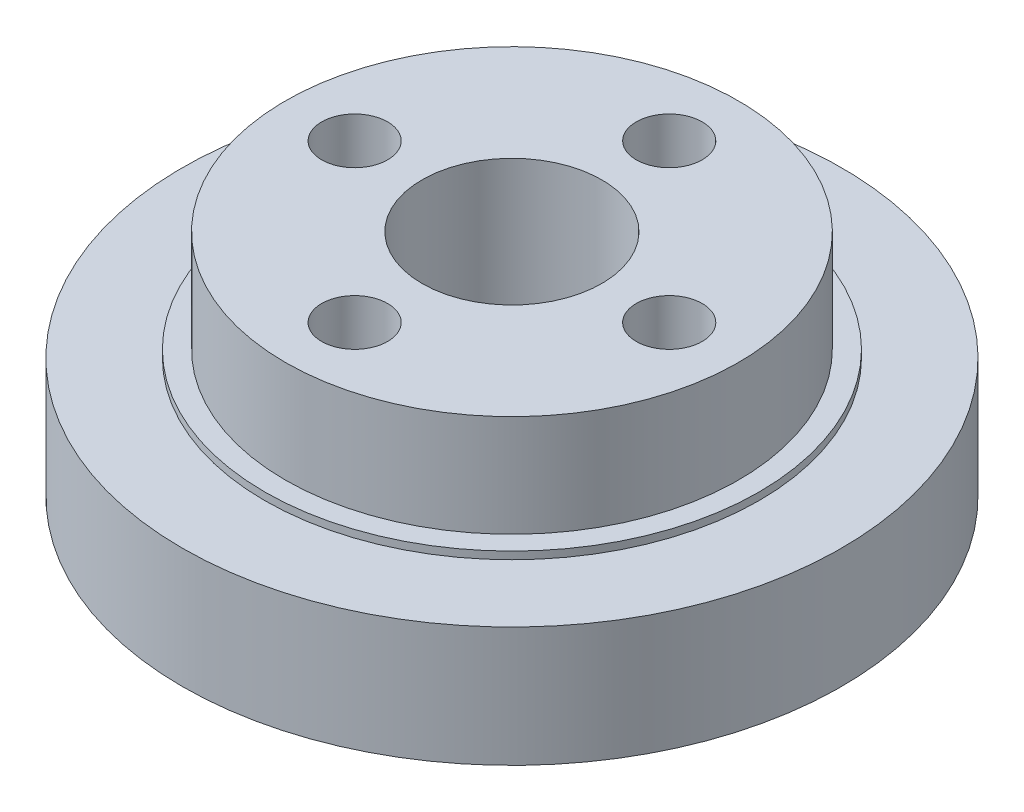
ISO-10303-21;
HEADER;
FILE_DESCRIPTION(('STEP AP214'),'2;1');
FILE_NAME('part.step','',(''),(''),'','','');
FILE_SCHEMA(('AUTOMOTIVE_DESIGN { 1 0 10303 214 1 1 1 1 }'));
ENDSEC;
DATA;
#1=APPLICATION_CONTEXT('core data for automotive mechanical design processes');
#2=APPLICATION_PROTOCOL_DEFINITION('international standard','automotive_design',2000,#1);
#3=PRODUCT_CONTEXT('',#1,'mechanical');
#4=PRODUCT('Part','Part','',(#3));
#5=PRODUCT_RELATED_PRODUCT_CATEGORY('part','',(#4));
#6=PRODUCT_DEFINITION_FORMATION('','',#4);
#7=PRODUCT_DEFINITION_CONTEXT('part definition',#1,'design');
#8=PRODUCT_DEFINITION('design','',#6,#7);
#9=PRODUCT_DEFINITION_SHAPE('','',#8);
#10=(LENGTH_UNIT() NAMED_UNIT(*) SI_UNIT(.MILLI.,.METRE.));
#11=(NAMED_UNIT(*) PLANE_ANGLE_UNIT() SI_UNIT($,.RADIAN.));
#12=(NAMED_UNIT(*) SI_UNIT($,.STERADIAN.) SOLID_ANGLE_UNIT());
#13=UNCERTAINTY_MEASURE_WITH_UNIT(LENGTH_MEASURE(1.E-05),#10,'distance_accuracy_value','');
#14=(GEOMETRIC_REPRESENTATION_CONTEXT(3) GLOBAL_UNCERTAINTY_ASSIGNED_CONTEXT((#13)) GLOBAL_UNIT_ASSIGNED_CONTEXT((#10,
#11,#12)) REPRESENTATION_CONTEXT('',''));
#15=CARTESIAN_POINT('',(0.,0.,0.));
#16=DIRECTION('',(0.,0.,1.));
#17=DIRECTION('',(1.,0.,0.));
#18=AXIS2_PLACEMENT_3D('',#15,#16,#17);
#19=CARTESIAN_POINT('',(0.,8.,0.));
#20=DIRECTION('',(0.,-1.,0.));
#21=DIRECTION('',(0.,0.,-1.));
#22=AXIS2_PLACEMENT_3D('',#19,#20,#21);
#23=CYLINDRICAL_SURFACE('',#22,22.);
#24=CARTESIAN_POINT('',(0.,8.,0.));
#25=DIRECTION('',(0.,1.,0.));
#26=DIRECTION('',(0.,0.,1.));
#27=AXIS2_PLACEMENT_3D('',#24,#25,#26);
#28=CIRCLE('',#27,22.);
#29=CARTESIAN_POINT('',(0.,8.,22.));
#30=VERTEX_POINT('',#29);
#31=EDGE_CURVE('E47',#30,#30,#28,.T.);
#32=ORIENTED_EDGE('',*,*,#31,.F.);
#33=EDGE_LOOP('',(#32));
#34=FACE_BOUND('',#33,.T.);
#35=CARTESIAN_POINT('',(0.,0.,0.));
#36=DIRECTION('',(0.,1.,0.));
#37=DIRECTION('',(0.,0.,1.));
#38=AXIS2_PLACEMENT_3D('',#35,#36,#37);
#39=CIRCLE('',#38,22.);
#40=CARTESIAN_POINT('',(0.,0.,22.));
#41=VERTEX_POINT('',#40);
#42=EDGE_CURVE('E37',#41,#41,#39,.T.);
#43=ORIENTED_EDGE('',*,*,#42,.T.);
#44=EDGE_LOOP('',(#43));
#45=FACE_BOUND('',#44,.T.);
#46=ADVANCED_FACE('F40',(#34,#45),#23,.T.);
#47=CARTESIAN_POINT('',(0.,8.,0.));
#48=DIRECTION('',(0.,1.,0.));
#49=DIRECTION('',(0.,0.,1.));
#50=AXIS2_PLACEMENT_3D('',#47,#48,#49);
#51=PLANE('',#50);
#52=CARTESIAN_POINT('',(0.,8.,0.));
#53=DIRECTION('',(0.,1.,0.));
#54=DIRECTION('',(0.,0.,1.));
#55=AXIS2_PLACEMENT_3D('',#52,#53,#54);
#56=CIRCLE('',#55,16.5);
#57=CARTESIAN_POINT('',(0.,8.,16.5));
#58=VERTEX_POINT('',#57);
#59=EDGE_CURVE('E42',#58,#58,#56,.T.);
#60=ORIENTED_EDGE('',*,*,#59,.F.);
#61=EDGE_LOOP('',(#60));
#62=FACE_BOUND('',#61,.T.);
#63=ORIENTED_EDGE('',*,*,#31,.T.);
#64=EDGE_LOOP('',(#63));
#65=FACE_BOUND('',#64,.T.);
#66=ADVANCED_FACE('F70',(#62,#65),#51,.T.);
#67=CARTESIAN_POINT('',(0.,0.,0.));
#68=DIRECTION('',(0.,1.,0.));
#69=DIRECTION('',(0.,0.,1.));
#70=AXIS2_PLACEMENT_3D('',#67,#68,#69);
#71=PLANE('',#70);
#72=CARTESIAN_POINT('',(11.6424272344222,0.,14.3772002869538));
#73=DIRECTION('',(0.,1.,0.));
#74=DIRECTION('',(-0.866025403784433,0.,0.50000000000001));
#75=AXIS2_PLACEMENT_3D('',#72,#73,#74);
#76=CIRCLE('',#75,1.6);
#77=CARTESIAN_POINT('',(10.2567865883671,0.,15.1772002869538));
#78=VERTEX_POINT('',#77);
#79=EDGE_CURVE('E367',#78,#78,#76,.T.);
#80=ORIENTED_EDGE('',*,*,#79,.T.);
#81=EDGE_LOOP('',(#80));
#82=FACE_BOUND('',#81,.T.);
#83=CARTESIAN_POINT('',(-6.62980706658789,0.,17.2712378901983));
#84=DIRECTION('',(0.,1.,0.));
#85=DIRECTION('',(-0.866025403784443,0.,-0.499999999999992));
#86=AXIS2_PLACEMENT_3D('',#83,#84,#85);
#87=CIRCLE('',#86,1.6);
#88=CARTESIAN_POINT('',(-8.015447712643,0.,16.4712378901983));
#89=VERTEX_POINT('',#88);
#90=EDGE_CURVE('E376',#89,#89,#87,.T.);
#91=ORIENTED_EDGE('',*,*,#90,.T.);
#92=EDGE_LOOP('',(#91));
#93=FACE_BOUND('',#92,.T.);
#94=CARTESIAN_POINT('',(-18.27223430101,0.,2.89403760324427));
#95=DIRECTION('',(0.,1.,0.));
#96=DIRECTION('',(0.,0.,-1.));
#97=AXIS2_PLACEMENT_3D('',#94,#95,#96);
#98=CIRCLE('',#97,1.6);
#99=CARTESIAN_POINT('',(-18.27223430101,0.,1.29403760324427));
#100=VERTEX_POINT('',#99);
#101=EDGE_CURVE('E385',#100,#100,#98,.T.);
#102=ORIENTED_EDGE('',*,*,#101,.T.);
#103=EDGE_LOOP('',(#102));
#104=FACE_BOUND('',#103,.T.);
#105=CARTESIAN_POINT('',(-11.6424272344221,0.,-14.3772002869539));
#106=DIRECTION('',(0.,1.,0.));
#107=DIRECTION('',(0.866025403784436,0.,-0.500000000000004));
#108=AXIS2_PLACEMENT_3D('',#105,#106,#107);
#109=CIRCLE('',#108,1.6);
#110=CARTESIAN_POINT('',(-10.256786588367,0.,-15.1772002869539));
#111=VERTEX_POINT('',#110);
#112=EDGE_CURVE('E389',#111,#111,#109,.T.);
#113=ORIENTED_EDGE('',*,*,#112,.T.);
#114=EDGE_LOOP('',(#113));
#115=FACE_BOUND('',#114,.T.);
#116=CARTESIAN_POINT('',(6.62980706658801,0.,-17.2712378901982));
#117=DIRECTION('',(0.,1.,0.));
#118=DIRECTION('',(0.86602540378444,0.,0.499999999999998));
#119=AXIS2_PLACEMENT_3D('',#116,#117,#118);
#120=CIRCLE('',#119,1.6);
#121=CARTESIAN_POINT('',(8.01544771264312,0.,-16.4712378901982));
#122=VERTEX_POINT('',#121);
#123=EDGE_CURVE('E365',#122,#122,#120,.T.);
#124=ORIENTED_EDGE('',*,*,#123,.T.);
#125=EDGE_LOOP('',(#124));
#126=FACE_BOUND('',#125,.T.);
#127=CARTESIAN_POINT('',(18.27223430101,0.,-2.89403760324427));
#128=DIRECTION('',(0.,1.,0.));
#129=DIRECTION('',(0.,0.,1.));
#130=AXIS2_PLACEMENT_3D('',#127,#128,#129);
#131=CIRCLE('',#130,1.6);
#132=CARTESIAN_POINT('',(18.27223430101,0.,-1.29403760324427));
#133=VERTEX_POINT('',#132);
#134=EDGE_CURVE('E356',#133,#133,#131,.T.);
#135=ORIENTED_EDGE('',*,*,#134,.T.);
#136=EDGE_LOOP('',(#135));
#137=FACE_BOUND('',#136,.T.);
#138=CARTESIAN_POINT('',(0.,0.,0.));
#139=DIRECTION('',(0.,1.,0.));
#140=DIRECTION('',(0.,0.,1.));
#141=AXIS2_PLACEMENT_3D('',#138,#139,#140);
#142=CIRCLE('',#141,6.);
#143=CARTESIAN_POINT('',(0.,0.,6.));
#144=VERTEX_POINT('',#143);
#145=EDGE_CURVE('E351',#144,#144,#142,.T.);
#146=ORIENTED_EDGE('',*,*,#145,.T.);
#147=EDGE_LOOP('',(#146));
#148=FACE_BOUND('',#147,.T.);
#149=ORIENTED_EDGE('',*,*,#42,.F.);
#150=EDGE_LOOP('',(#149));
#151=FACE_BOUND('',#150,.T.);
#152=ADVANCED_FACE('F63',(#82,#93,#104,#115,#126,#137,#148,#151),#71,.F.);
#153=CARTESIAN_POINT('',(0.,8.5,0.));
#154=DIRECTION('',(0.,-1.,0.));
#155=DIRECTION('',(0.,0.,-1.));
#156=AXIS2_PLACEMENT_3D('',#153,#154,#155);
#157=CYLINDRICAL_SURFACE('',#156,16.5);
#158=CARTESIAN_POINT('',(0.,8.5,0.));
#159=DIRECTION('',(0.,1.,0.));
#160=DIRECTION('',(0.,0.,1.));
#161=AXIS2_PLACEMENT_3D('',#158,#159,#160);
#162=CIRCLE('',#161,16.5);
#163=CARTESIAN_POINT('',(0.,8.5,16.5));
#164=VERTEX_POINT('',#163);
#165=EDGE_CURVE('E54',#164,#164,#162,.T.);
#166=ORIENTED_EDGE('',*,*,#165,.F.);
#167=EDGE_LOOP('',(#166));
#168=FACE_BOUND('',#167,.T.);
#169=ORIENTED_EDGE('',*,*,#59,.T.);
#170=EDGE_LOOP('',(#169));
#171=FACE_BOUND('',#170,.T.);
#172=ADVANCED_FACE('F68',(#168,#171),#157,.T.);
#173=CARTESIAN_POINT('',(0.,8.5,0.));
#174=DIRECTION('',(0.,1.,0.));
#175=DIRECTION('',(0.,0.,1.));
#176=AXIS2_PLACEMENT_3D('',#173,#174,#175);
#177=PLANE('',#176);
#178=CARTESIAN_POINT('',(0.,8.5,0.));
#179=DIRECTION('',(0.,1.,0.));
#180=DIRECTION('',(0.,0.,1.));
#181=AXIS2_PLACEMENT_3D('',#178,#179,#180);
#182=CIRCLE('',#181,15.125);
#183=CARTESIAN_POINT('',(0.,8.5,15.125));
#184=VERTEX_POINT('',#183);
#185=EDGE_CURVE('E10',#184,#184,#182,.T.);
#186=ORIENTED_EDGE('',*,*,#185,.F.);
#187=EDGE_LOOP('',(#186));
#188=FACE_BOUND('',#187,.T.);
#189=ORIENTED_EDGE('',*,*,#165,.T.);
#190=EDGE_LOOP('',(#189));
#191=FACE_BOUND('',#190,.T.);
#192=ADVANCED_FACE('F74',(#188,#191),#177,.T.);
#193=CARTESIAN_POINT('',(0.,15.3,0.));
#194=DIRECTION('',(0.,-1.,0.));
#195=DIRECTION('',(0.,0.,-1.));
#196=AXIS2_PLACEMENT_3D('',#193,#194,#195);
#197=CYLINDRICAL_SURFACE('',#196,15.125);
#198=CARTESIAN_POINT('',(0.,15.3,0.));
#199=DIRECTION('',(0.,1.,0.));
#200=DIRECTION('',(0.,0.,1.));
#201=AXIS2_PLACEMENT_3D('',#198,#199,#200);
#202=CIRCLE('',#201,15.125);
#203=CARTESIAN_POINT('',(0.,15.3,15.125));
#204=VERTEX_POINT('',#203);
#205=EDGE_CURVE('E52',#204,#204,#202,.T.);
#206=ORIENTED_EDGE('',*,*,#205,.F.);
#207=EDGE_LOOP('',(#206));
#208=FACE_BOUND('',#207,.T.);
#209=ORIENTED_EDGE('',*,*,#185,.T.);
#210=EDGE_LOOP('',(#209));
#211=FACE_BOUND('',#210,.T.);
#212=ADVANCED_FACE('F103',(#208,#211),#197,.T.);
#213=CARTESIAN_POINT('',(0.,15.3,0.));
#214=DIRECTION('',(0.,1.,0.));
#215=DIRECTION('',(0.,0.,1.));
#216=AXIS2_PLACEMENT_3D('',#213,#214,#215);
#217=PLANE('',#216);
#218=CARTESIAN_POINT('',(0.,15.3,10.5));
#219=DIRECTION('',(0.,1.,0.));
#220=DIRECTION('',(-1.,0.,0.));
#221=AXIS2_PLACEMENT_3D('',#218,#219,#220);
#222=CIRCLE('',#221,2.2);
#223=CARTESIAN_POINT('',(-2.20000000000004,15.3,10.5));
#224=VERTEX_POINT('',#223);
#225=EDGE_CURVE('E335',#224,#224,#222,.T.);
#226=ORIENTED_EDGE('',*,*,#225,.F.);
#227=EDGE_LOOP('',(#226));
#228=FACE_BOUND('',#227,.T.);
#229=CARTESIAN_POINT('',(-10.5,15.3,0.));
#230=DIRECTION('',(0.,1.,0.));
#231=DIRECTION('',(0.,0.,-1.));
#232=AXIS2_PLACEMENT_3D('',#229,#230,#231);
#233=CIRCLE('',#232,2.2);
#234=CARTESIAN_POINT('',(-10.5,15.3,-2.2));
#235=VERTEX_POINT('',#234);
#236=EDGE_CURVE('E336',#235,#235,#233,.T.);
#237=ORIENTED_EDGE('',*,*,#236,.F.);
#238=EDGE_LOOP('',(#237));
#239=FACE_BOUND('',#238,.T.);
#240=CARTESIAN_POINT('',(1.09981662173559E-13,15.3,-10.5));
#241=DIRECTION('',(0.,1.,0.));
#242=DIRECTION('',(1.,0.,0.));
#243=AXIS2_PLACEMENT_3D('',#240,#241,#242);
#244=CIRCLE('',#243,2.2);
#245=CARTESIAN_POINT('',(2.20000000000011,15.3,-10.5));
#246=VERTEX_POINT('',#245);
#247=EDGE_CURVE('E340',#246,#246,#244,.T.);
#248=ORIENTED_EDGE('',*,*,#247,.F.);
#249=EDGE_LOOP('',(#248));
#250=FACE_BOUND('',#249,.T.);
#251=CARTESIAN_POINT('',(10.5,15.3,0.));
#252=DIRECTION('',(0.,1.,0.));
#253=DIRECTION('',(0.,0.,1.));
#254=AXIS2_PLACEMENT_3D('',#251,#252,#253);
#255=CIRCLE('',#254,2.2);
#256=CARTESIAN_POINT('',(10.5,15.3,2.2));
#257=VERTEX_POINT('',#256);
#258=EDGE_CURVE('E344',#257,#257,#255,.T.);
#259=ORIENTED_EDGE('',*,*,#258,.F.);
#260=EDGE_LOOP('',(#259));
#261=FACE_BOUND('',#260,.T.);
#262=CARTESIAN_POINT('',(0.,15.3,0.));
#263=DIRECTION('',(0.,1.,0.));
#264=DIRECTION('',(0.,0.,1.));
#265=AXIS2_PLACEMENT_3D('',#262,#263,#264);
#266=CIRCLE('',#265,6.);
#267=CARTESIAN_POINT('',(0.,15.3,6.));
#268=VERTEX_POINT('',#267);
#269=EDGE_CURVE('E346',#268,#268,#266,.T.);
#270=ORIENTED_EDGE('',*,*,#269,.F.);
#271=EDGE_LOOP('',(#270));
#272=FACE_BOUND('',#271,.T.);
#273=ORIENTED_EDGE('',*,*,#205,.T.);
#274=EDGE_LOOP('',(#273));
#275=FACE_BOUND('',#274,.T.);
#276=ADVANCED_FACE('F115',(#228,#239,#250,#261,#272,#275),#217,.T.);
#277=CARTESIAN_POINT('',(0.,0.,0.));
#278=DIRECTION('',(0.,1.,0.));
#279=DIRECTION('',(0.,0.,1.));
#280=AXIS2_PLACEMENT_3D('',#277,#278,#279);
#281=CYLINDRICAL_SURFACE('',#280,6.);
#282=ORIENTED_EDGE('',*,*,#145,.F.);
#283=EDGE_LOOP('',(#282));
#284=FACE_BOUND('',#283,.T.);
#285=ORIENTED_EDGE('',*,*,#269,.T.);
#286=EDGE_LOOP('',(#285));
#287=FACE_BOUND('',#286,.T.);
#288=ADVANCED_FACE('F118',(#284,#287),#281,.F.);
#289=CARTESIAN_POINT('',(18.27223430101,7.,-2.89403760324427));
#290=DIRECTION('',(0.,-1.,0.));
#291=DIRECTION('',(0.,0.,-1.));
#292=AXIS2_PLACEMENT_3D('',#289,#290,#291);
#293=CYLINDRICAL_SURFACE('',#292,1.6);
#294=CARTESIAN_POINT('',(18.27223430101,7.,-2.89403760324427));
#295=DIRECTION('',(0.,1.,0.));
#296=DIRECTION('',(0.,0.,1.));
#297=AXIS2_PLACEMENT_3D('',#294,#295,#296);
#298=CIRCLE('',#297,1.6);
#299=CARTESIAN_POINT('',(18.27223430101,7.,-1.29403760324427));
#300=VERTEX_POINT('',#299);
#301=EDGE_CURVE('E358',#300,#300,#298,.T.);
#302=ORIENTED_EDGE('',*,*,#301,.T.);
#303=EDGE_LOOP('',(#302));
#304=FACE_BOUND('',#303,.T.);
#305=ORIENTED_EDGE('',*,*,#134,.F.);
#306=EDGE_LOOP('',(#305));
#307=FACE_BOUND('',#306,.T.);
#308=ADVANCED_FACE('F121',(#304,#307),#293,.F.);
#309=CARTESIAN_POINT('',(18.27223430101,7.,-2.89403760324427));
#310=DIRECTION('',(0.,1.,0.));
#311=DIRECTION('',(0.,0.,1.));
#312=AXIS2_PLACEMENT_3D('',#309,#310,#311);
#313=PLANE('',#312);
#314=ORIENTED_EDGE('',*,*,#301,.F.);
#315=EDGE_LOOP('',(#314));
#316=FACE_BOUND('',#315,.T.);
#317=ADVANCED_FACE('F131',(#316),#313,.F.);
#318=CARTESIAN_POINT('',(6.62980706658801,7.,-17.2712378901982));
#319=DIRECTION('',(0.,-1.,0.));
#320=DIRECTION('',(0.,0.,-1.));
#321=AXIS2_PLACEMENT_3D('',#318,#319,#320);
#322=CYLINDRICAL_SURFACE('',#321,1.6);
#323=CARTESIAN_POINT('',(6.62980706658801,7.,-17.2712378901982));
#324=DIRECTION('',(0.,1.,0.));
#325=DIRECTION('',(0.86602540378444,0.,0.499999999999998));
#326=AXIS2_PLACEMENT_3D('',#323,#324,#325);
#327=CIRCLE('',#326,1.6);
#328=CARTESIAN_POINT('',(8.01544771264312,7.,-16.4712378901982));
#329=VERTEX_POINT('',#328);
#330=EDGE_CURVE('E363',#329,#329,#327,.T.);
#331=ORIENTED_EDGE('',*,*,#330,.T.);
#332=EDGE_LOOP('',(#331));
#333=FACE_BOUND('',#332,.T.);
#334=ORIENTED_EDGE('',*,*,#123,.F.);
#335=EDGE_LOOP('',(#334));
#336=FACE_BOUND('',#335,.T.);
#337=ADVANCED_FACE('F139',(#333,#336),#322,.F.);
#338=CARTESIAN_POINT('',(6.62980706658801,7.,-17.2712378901982));
#339=DIRECTION('',(0.,1.,0.));
#340=DIRECTION('',(0.86602540378444,0.,0.499999999999998));
#341=AXIS2_PLACEMENT_3D('',#338,#339,#340);
#342=PLANE('',#341);
#343=ORIENTED_EDGE('',*,*,#330,.F.);
#344=EDGE_LOOP('',(#343));
#345=FACE_BOUND('',#344,.T.);
#346=ADVANCED_FACE('F151',(#345),#342,.F.);
#347=CARTESIAN_POINT('',(-11.6424272344221,7.,-14.3772002869539));
#348=DIRECTION('',(0.,-1.,0.));
#349=DIRECTION('',(0.,0.,-1.));
#350=AXIS2_PLACEMENT_3D('',#347,#348,#349);
#351=CYLINDRICAL_SURFACE('',#350,1.6);
#352=CARTESIAN_POINT('',(-11.6424272344221,7.,-14.3772002869539));
#353=DIRECTION('',(0.,1.,0.));
#354=DIRECTION('',(0.866025403784436,0.,-0.500000000000004));
#355=AXIS2_PLACEMENT_3D('',#352,#353,#354);
#356=CIRCLE('',#355,1.6);
#357=CARTESIAN_POINT('',(-10.256786588367,7.,-15.1772002869539));
#358=VERTEX_POINT('',#357);
#359=EDGE_CURVE('E370',#358,#358,#356,.T.);
#360=ORIENTED_EDGE('',*,*,#359,.T.);
#361=EDGE_LOOP('',(#360));
#362=FACE_BOUND('',#361,.T.);
#363=ORIENTED_EDGE('',*,*,#112,.F.);
#364=EDGE_LOOP('',(#363));
#365=FACE_BOUND('',#364,.T.);
#366=ADVANCED_FACE('F161',(#362,#365),#351,.F.);
#367=CARTESIAN_POINT('',(-11.6424272344221,7.,-14.3772002869539));
#368=DIRECTION('',(0.,1.,0.));
#369=DIRECTION('',(0.866025403784436,0.,-0.500000000000004));
#370=AXIS2_PLACEMENT_3D('',#367,#368,#369);
#371=PLANE('',#370);
#372=ORIENTED_EDGE('',*,*,#359,.F.);
#373=EDGE_LOOP('',(#372));
#374=FACE_BOUND('',#373,.T.);
#375=ADVANCED_FACE('F171',(#374),#371,.F.);
#376=CARTESIAN_POINT('',(-18.27223430101,7.,2.89403760324427));
#377=DIRECTION('',(0.,-1.,0.));
#378=DIRECTION('',(0.,0.,-1.));
#379=AXIS2_PLACEMENT_3D('',#376,#377,#378);
#380=CYLINDRICAL_SURFACE('',#379,1.6);
#381=CARTESIAN_POINT('',(-18.27223430101,7.,2.89403760324427));
#382=DIRECTION('',(0.,1.,0.));
#383=DIRECTION('',(0.,0.,-1.));
#384=AXIS2_PLACEMENT_3D('',#381,#382,#383);
#385=CIRCLE('',#384,1.6);
#386=CARTESIAN_POINT('',(-18.27223430101,7.,1.29403760324427));
#387=VERTEX_POINT('',#386);
#388=EDGE_CURVE('E384',#387,#387,#385,.T.);
#389=ORIENTED_EDGE('',*,*,#388,.T.);
#390=EDGE_LOOP('',(#389));
#391=FACE_BOUND('',#390,.T.);
#392=ORIENTED_EDGE('',*,*,#101,.F.);
#393=EDGE_LOOP('',(#392));
#394=FACE_BOUND('',#393,.T.);
#395=ADVANCED_FACE('F182',(#391,#394),#380,.F.);
#396=CARTESIAN_POINT('',(-18.27223430101,7.,2.89403760324427));
#397=DIRECTION('',(0.,1.,0.));
#398=DIRECTION('',(0.,0.,-1.));
#399=AXIS2_PLACEMENT_3D('',#396,#397,#398);
#400=PLANE('',#399);
#401=ORIENTED_EDGE('',*,*,#388,.F.);
#402=EDGE_LOOP('',(#401));
#403=FACE_BOUND('',#402,.T.);
#404=ADVANCED_FACE('F193',(#403),#400,.F.);
#405=CARTESIAN_POINT('',(-6.62980706658789,7.,17.2712378901983));
#406=DIRECTION('',(0.,-1.,0.));
#407=DIRECTION('',(0.,0.,-1.));
#408=AXIS2_PLACEMENT_3D('',#405,#406,#407);
#409=CYLINDRICAL_SURFACE('',#408,1.6);
#410=CARTESIAN_POINT('',(-6.62980706658789,7.,17.2712378901983));
#411=DIRECTION('',(0.,1.,0.));
#412=DIRECTION('',(-0.866025403784443,0.,-0.499999999999992));
#413=AXIS2_PLACEMENT_3D('',#410,#411,#412);
#414=CIRCLE('',#413,1.6);
#415=CARTESIAN_POINT('',(-8.015447712643,7.,16.4712378901983));
#416=VERTEX_POINT('',#415);
#417=EDGE_CURVE('E377',#416,#416,#414,.T.);
#418=ORIENTED_EDGE('',*,*,#417,.T.);
#419=EDGE_LOOP('',(#418));
#420=FACE_BOUND('',#419,.T.);
#421=ORIENTED_EDGE('',*,*,#90,.F.);
#422=EDGE_LOOP('',(#421));
#423=FACE_BOUND('',#422,.T.);
#424=ADVANCED_FACE('F203',(#420,#423),#409,.F.);
#425=CARTESIAN_POINT('',(-6.62980706658789,7.,17.2712378901983));
#426=DIRECTION('',(0.,1.,0.));
#427=DIRECTION('',(-0.866025403784443,0.,-0.499999999999992));
#428=AXIS2_PLACEMENT_3D('',#425,#426,#427);
#429=PLANE('',#428);
#430=ORIENTED_EDGE('',*,*,#417,.F.);
#431=EDGE_LOOP('',(#430));
#432=FACE_BOUND('',#431,.T.);
#433=ADVANCED_FACE('F211',(#432),#429,.F.);
#434=CARTESIAN_POINT('',(11.6424272344222,7.,14.3772002869538));
#435=DIRECTION('',(0.,-1.,0.));
#436=DIRECTION('',(0.,0.,-1.));
#437=AXIS2_PLACEMENT_3D('',#434,#435,#436);
#438=CYLINDRICAL_SURFACE('',#437,1.6);
#439=CARTESIAN_POINT('',(11.6424272344222,7.,14.3772002869538));
#440=DIRECTION('',(0.,1.,0.));
#441=DIRECTION('',(-0.866025403784433,0.,0.50000000000001));
#442=AXIS2_PLACEMENT_3D('',#439,#440,#441);
#443=CIRCLE('',#442,1.6);
#444=CARTESIAN_POINT('',(10.2567865883671,7.,15.1772002869538));
#445=VERTEX_POINT('',#444);
#446=EDGE_CURVE('E375',#445,#445,#443,.T.);
#447=ORIENTED_EDGE('',*,*,#446,.T.);
#448=EDGE_LOOP('',(#447));
#449=FACE_BOUND('',#448,.T.);
#450=ORIENTED_EDGE('',*,*,#79,.F.);
#451=EDGE_LOOP('',(#450));
#452=FACE_BOUND('',#451,.T.);
#453=ADVANCED_FACE('F222',(#449,#452),#438,.F.);
#454=CARTESIAN_POINT('',(11.6424272344222,7.,14.3772002869538));
#455=DIRECTION('',(0.,1.,0.));
#456=DIRECTION('',(-0.866025403784433,0.,0.50000000000001));
#457=AXIS2_PLACEMENT_3D('',#454,#455,#456);
#458=PLANE('',#457);
#459=ORIENTED_EDGE('',*,*,#446,.F.);
#460=EDGE_LOOP('',(#459));
#461=FACE_BOUND('',#460,.T.);
#462=ADVANCED_FACE('F233',(#461),#458,.F.);
#463=CARTESIAN_POINT('',(10.5,9.8,0.));
#464=DIRECTION('',(0.,1.,0.));
#465=DIRECTION('',(0.,0.,1.));
#466=AXIS2_PLACEMENT_3D('',#463,#464,#465);
#467=CYLINDRICAL_SURFACE('',#466,2.2);
#468=CARTESIAN_POINT('',(10.5,9.8,0.));
#469=DIRECTION('',(0.,1.,0.));
#470=DIRECTION('',(0.,0.,1.));
#471=AXIS2_PLACEMENT_3D('',#468,#469,#470);
#472=CIRCLE('',#471,2.2);
#473=CARTESIAN_POINT('',(10.5,9.8,2.2));
#474=VERTEX_POINT('',#473);
#475=EDGE_CURVE('E373',#474,#474,#472,.T.);
#476=ORIENTED_EDGE('',*,*,#475,.F.);
#477=EDGE_LOOP('',(#476));
#478=FACE_BOUND('',#477,.T.);
#479=ORIENTED_EDGE('',*,*,#258,.T.);
#480=EDGE_LOOP('',(#479));
#481=FACE_BOUND('',#480,.T.);
#482=ADVANCED_FACE('F241',(#478,#481),#467,.F.);
#483=CARTESIAN_POINT('',(10.5,9.8,0.));
#484=DIRECTION('',(0.,1.,0.));
#485=DIRECTION('',(0.,0.,1.));
#486=AXIS2_PLACEMENT_3D('',#483,#484,#485);
#487=PLANE('',#486);
#488=ORIENTED_EDGE('',*,*,#475,.T.);
#489=EDGE_LOOP('',(#488));
#490=FACE_BOUND('',#489,.T.);
#491=ADVANCED_FACE('F253',(#490),#487,.T.);
#492=CARTESIAN_POINT('',(1.09981662173559E-13,9.8,-10.5));
#493=DIRECTION('',(0.,1.,0.));
#494=DIRECTION('',(0.,0.,1.));
#495=AXIS2_PLACEMENT_3D('',#492,#493,#494);
#496=CYLINDRICAL_SURFACE('',#495,2.2);
#497=CARTESIAN_POINT('',(1.09981662173559E-13,9.8,-10.5));
#498=DIRECTION('',(0.,1.,0.));
#499=DIRECTION('',(1.,0.,0.));
#500=AXIS2_PLACEMENT_3D('',#497,#498,#499);
#501=CIRCLE('',#500,2.2);
#502=CARTESIAN_POINT('',(2.20000000000011,9.8,-10.5));
#503=VERTEX_POINT('',#502);
#504=EDGE_CURVE('E396',#503,#503,#501,.T.);
#505=ORIENTED_EDGE('',*,*,#504,.F.);
#506=EDGE_LOOP('',(#505));
#507=FACE_BOUND('',#506,.T.);
#508=ORIENTED_EDGE('',*,*,#247,.T.);
#509=EDGE_LOOP('',(#508));
#510=FACE_BOUND('',#509,.T.);
#511=ADVANCED_FACE('F261',(#507,#510),#496,.F.);
#512=CARTESIAN_POINT('',(1.09981662173559E-13,9.8,-10.5));
#513=DIRECTION('',(0.,1.,0.));
#514=DIRECTION('',(1.,0.,0.));
#515=AXIS2_PLACEMENT_3D('',#512,#513,#514);
#516=PLANE('',#515);
#517=ORIENTED_EDGE('',*,*,#504,.T.);
#518=EDGE_LOOP('',(#517));
#519=FACE_BOUND('',#518,.T.);
#520=ADVANCED_FACE('F275',(#519),#516,.T.);
#521=CARTESIAN_POINT('',(-10.5,9.8,0.));
#522=DIRECTION('',(0.,1.,0.));
#523=DIRECTION('',(0.,0.,1.));
#524=AXIS2_PLACEMENT_3D('',#521,#522,#523);
#525=CYLINDRICAL_SURFACE('',#524,2.2);
#526=CARTESIAN_POINT('',(-10.5,9.8,0.));
#527=DIRECTION('',(0.,1.,0.));
#528=DIRECTION('',(0.,0.,-1.));
#529=AXIS2_PLACEMENT_3D('',#526,#527,#528);
#530=CIRCLE('',#529,2.2);
#531=CARTESIAN_POINT('',(-10.5,9.8,-2.2));
#532=VERTEX_POINT('',#531);
#533=EDGE_CURVE('E405',#532,#532,#530,.T.);
#534=ORIENTED_EDGE('',*,*,#533,.F.);
#535=EDGE_LOOP('',(#534));
#536=FACE_BOUND('',#535,.T.);
#537=ORIENTED_EDGE('',*,*,#236,.T.);
#538=EDGE_LOOP('',(#537));
#539=FACE_BOUND('',#538,.T.);
#540=ADVANCED_FACE('F282',(#536,#539),#525,.F.);
#541=CARTESIAN_POINT('',(-10.5,9.8,0.));
#542=DIRECTION('',(0.,1.,0.));
#543=DIRECTION('',(0.,0.,-1.));
#544=AXIS2_PLACEMENT_3D('',#541,#542,#543);
#545=PLANE('',#544);
#546=ORIENTED_EDGE('',*,*,#533,.T.);
#547=EDGE_LOOP('',(#546));
#548=FACE_BOUND('',#547,.T.);
#549=ADVANCED_FACE('F295',(#548),#545,.T.);
#550=CARTESIAN_POINT('',(0.,9.8,10.5));
#551=DIRECTION('',(0.,1.,0.));
#552=DIRECTION('',(0.,0.,1.));
#553=AXIS2_PLACEMENT_3D('',#550,#551,#552);
#554=CYLINDRICAL_SURFACE('',#553,2.2);
#555=CARTESIAN_POINT('',(0.,9.8,10.5));
#556=DIRECTION('',(0.,1.,0.));
#557=DIRECTION('',(-1.,0.,0.));
#558=AXIS2_PLACEMENT_3D('',#555,#556,#557);
#559=CIRCLE('',#558,2.2);
#560=CARTESIAN_POINT('',(-2.20000000000004,9.8,10.5));
#561=VERTEX_POINT('',#560);
#562=EDGE_CURVE('E393',#561,#561,#559,.T.);
#563=ORIENTED_EDGE('',*,*,#562,.F.);
#564=EDGE_LOOP('',(#563));
#565=FACE_BOUND('',#564,.T.);
#566=ORIENTED_EDGE('',*,*,#225,.T.);
#567=EDGE_LOOP('',(#566));
#568=FACE_BOUND('',#567,.T.);
#569=ADVANCED_FACE('F305',(#565,#568),#554,.F.);
#570=CARTESIAN_POINT('',(0.,9.8,10.5));
#571=DIRECTION('',(0.,1.,0.));
#572=DIRECTION('',(-1.,0.,0.));
#573=AXIS2_PLACEMENT_3D('',#570,#571,#572);
#574=PLANE('',#573);
#575=ORIENTED_EDGE('',*,*,#562,.T.);
#576=EDGE_LOOP('',(#575));
#577=FACE_BOUND('',#576,.T.);
#578=ADVANCED_FACE('F315',(#577),#574,.T.);
#579=CLOSED_SHELL('',(#46,#66,#152,#172,#192,#212,#276,#288,#308,#317,#337,#346,#366,#375,#395,
#404,#424,#433,#453,#462,#482,#491,#511,#520,#540,#549,#569,#578));
#580=MANIFOLD_SOLID_BREP('B2',#579);
#581=ADVANCED_BREP_SHAPE_REPRESENTATION('',(#18,#580),#14);
#582=SHAPE_DEFINITION_REPRESENTATION(#9,#581);
ENDSEC;
END-ISO-10303-21;
